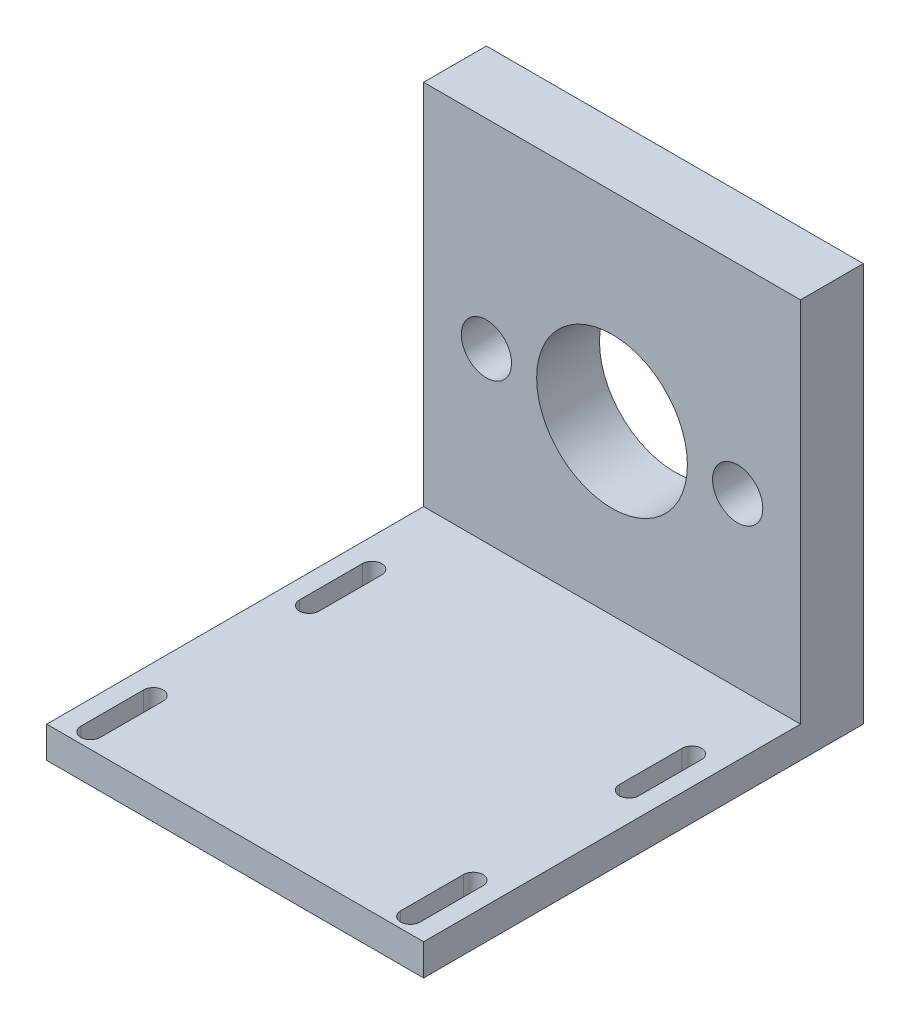
ISO-10303-21;
HEADER;
FILE_DESCRIPTION(('STEP AP214'),'2;1');
FILE_NAME('part.step','',(''),(''),'','','');
FILE_SCHEMA(('AUTOMOTIVE_DESIGN { 1 0 10303 214 1 1 1 1 }'));
ENDSEC;
DATA;
#1=APPLICATION_CONTEXT('core data for automotive mechanical design processes');
#2=APPLICATION_PROTOCOL_DEFINITION('international standard','automotive_design',2000,#1);
#3=PRODUCT_CONTEXT('',#1,'mechanical');
#4=PRODUCT('Part','Part','',(#3));
#5=PRODUCT_RELATED_PRODUCT_CATEGORY('part','',(#4));
#6=PRODUCT_DEFINITION_FORMATION('','',#4);
#7=PRODUCT_DEFINITION_CONTEXT('part definition',#1,'design');
#8=PRODUCT_DEFINITION('design','',#6,#7);
#9=PRODUCT_DEFINITION_SHAPE('','',#8);
#10=(LENGTH_UNIT() NAMED_UNIT(*) SI_UNIT(.MILLI.,.METRE.));
#11=(NAMED_UNIT(*) PLANE_ANGLE_UNIT() SI_UNIT($,.RADIAN.));
#12=(NAMED_UNIT(*) SI_UNIT($,.STERADIAN.) SOLID_ANGLE_UNIT());
#13=UNCERTAINTY_MEASURE_WITH_UNIT(LENGTH_MEASURE(1.E-05),#10,'distance_accuracy_value','');
#14=(GEOMETRIC_REPRESENTATION_CONTEXT(3) GLOBAL_UNCERTAINTY_ASSIGNED_CONTEXT((#13)) GLOBAL_UNIT_ASSIGNED_CONTEXT((#10,
#11,#12)) REPRESENTATION_CONTEXT('',''));
#15=CARTESIAN_POINT('',(0.,0.,0.));
#16=DIRECTION('',(0.,0.,1.));
#17=DIRECTION('',(1.,0.,0.));
#18=AXIS2_PLACEMENT_3D('',#15,#16,#17);
#19=CARTESIAN_POINT('',(-30.,-26.75,70.));
#20=DIRECTION('',(0.,-1.,0.));
#21=DIRECTION('',(1.,0.,0.));
#22=AXIS2_PLACEMENT_3D('',#19,#20,#21);
#23=PLANE('',#22);
#24=DIRECTION('',(0.,0.,-1.));
#25=VECTOR('',#24,1.);
#26=CARTESIAN_POINT('',(-23.9092592592593,-26.75,70.));
#27=LINE('',#26,#25);
#28=CARTESIAN_POINT('',(-23.9092592592593,-26.75,67.5574712643677));
#29=VERTEX_POINT('',#28);
#30=CARTESIAN_POINT('',(-23.9092592592593,-26.75,57.5574712643677));
#31=VERTEX_POINT('',#30);
#32=EDGE_CURVE('E550',#29,#31,#27,.T.);
#33=ORIENTED_EDGE('',*,*,#32,.F.);
#34=CARTESIAN_POINT('',(-25.4592592592593,-26.75,67.5574712643677));
#35=DIRECTION('',(0.,-1.,0.));
#36=DIRECTION('',(1.,0.,0.));
#37=AXIS2_PLACEMENT_3D('',#34,#35,#36);
#38=CIRCLE('',#37,1.54999999999999);
#39=CARTESIAN_POINT('',(-27.0092592592593,-26.75,67.5574712643677));
#40=VERTEX_POINT('',#39);
#41=EDGE_CURVE('E544',#29,#40,#38,.T.);
#42=ORIENTED_EDGE('',*,*,#41,.T.);
#43=DIRECTION('',(0.,0.,-1.));
#44=VECTOR('',#43,1.);
#45=CARTESIAN_POINT('',(-27.0092592592593,-26.75,70.));
#46=LINE('',#45,#44);
#47=CARTESIAN_POINT('',(-27.0092592592593,-26.75,57.5574712643677));
#48=VERTEX_POINT('',#47);
#49=EDGE_CURVE('E541',#40,#48,#46,.T.);
#50=ORIENTED_EDGE('',*,*,#49,.T.);
#51=CARTESIAN_POINT('',(-25.4592592592593,-26.75,57.5574712643677));
#52=DIRECTION('',(0.,-1.,0.));
#53=DIRECTION('',(1.,0.,0.));
#54=AXIS2_PLACEMENT_3D('',#51,#52,#53);
#55=CIRCLE('',#54,1.54999999999999);
#56=EDGE_CURVE('E547',#48,#31,#55,.T.);
#57=ORIENTED_EDGE('',*,*,#56,.T.);
#58=EDGE_LOOP('',(#33,#42,#50,#57));
#59=FACE_BOUND('',#58,.T.);
#60=DIRECTION('',(0.,0.,-1.));
#61=VECTOR('',#60,1.);
#62=CARTESIAN_POINT('',(27.0092592592593,-26.75,70.));
#63=LINE('',#62,#61);
#64=CARTESIAN_POINT('',(27.0092592592593,-26.75,32.7490421455937));
#65=VERTEX_POINT('',#64);
#66=CARTESIAN_POINT('',(27.0092592592593,-26.75,22.7490421455937));
#67=VERTEX_POINT('',#66);
#68=EDGE_CURVE('E13',#65,#67,#63,.T.);
#69=ORIENTED_EDGE('',*,*,#68,.F.);
#70=CARTESIAN_POINT('',(25.4592592592593,-26.75,32.7490421455937));
#71=DIRECTION('',(0.,-1.,0.));
#72=DIRECTION('',(1.,0.,0.));
#73=AXIS2_PLACEMENT_3D('',#70,#71,#72);
#74=CIRCLE('',#73,1.54999999999999);
#75=CARTESIAN_POINT('',(23.9092592592593,-26.75,32.7490421455937));
#76=VERTEX_POINT('',#75);
#77=EDGE_CURVE('E343',#65,#76,#74,.T.);
#78=ORIENTED_EDGE('',*,*,#77,.T.);
#79=DIRECTION('',(0.,0.,-1.));
#80=VECTOR('',#79,1.);
#81=CARTESIAN_POINT('',(23.9092592592593,-26.75,70.));
#82=LINE('',#81,#80);
#83=CARTESIAN_POINT('',(23.9092592592593,-26.75,22.7490421455937));
#84=VERTEX_POINT('',#83);
#85=EDGE_CURVE('E674',#76,#84,#82,.T.);
#86=ORIENTED_EDGE('',*,*,#85,.T.);
#87=CARTESIAN_POINT('',(25.4592592592593,-26.75,22.7490421455937));
#88=DIRECTION('',(0.,-1.,0.));
#89=DIRECTION('',(1.,0.,0.));
#90=AXIS2_PLACEMENT_3D('',#87,#88,#89);
#91=CIRCLE('',#90,1.54999999999999);
#92=EDGE_CURVE('E677',#84,#67,#91,.T.);
#93=ORIENTED_EDGE('',*,*,#92,.T.);
#94=EDGE_LOOP('',(#69,#78,#86,#93));
#95=FACE_BOUND('',#94,.T.);
#96=DIRECTION('',(-1.,0.,0.));
#97=VECTOR('',#96,1.);
#98=CARTESIAN_POINT('',(-30.,-26.75,10.));
#99=LINE('',#98,#97);
#100=CARTESIAN_POINT('',(30.,-26.75,10.));
#101=VERTEX_POINT('',#100);
#102=CARTESIAN_POINT('',(-30.,-26.75,10.));
#103=VERTEX_POINT('',#102);
#104=EDGE_CURVE('E604',#101,#103,#99,.T.);
#105=ORIENTED_EDGE('',*,*,#104,.T.);
#106=DIRECTION('',(0.,0.,-1.));
#107=VECTOR('',#106,1.);
#108=CARTESIAN_POINT('',(-30.,-26.75,70.));
#109=LINE('',#108,#107);
#110=CARTESIAN_POINT('',(-30.,-26.75,70.));
#111=VERTEX_POINT('',#110);
#112=EDGE_CURVE('E615',#111,#103,#109,.T.);
#113=ORIENTED_EDGE('',*,*,#112,.F.);
#114=DIRECTION('',(-1.,0.,0.));
#115=VECTOR('',#114,1.);
#116=CARTESIAN_POINT('',(-30.,-26.75,70.));
#117=LINE('',#116,#115);
#118=CARTESIAN_POINT('',(30.,-26.75,70.));
#119=VERTEX_POINT('',#118);
#120=EDGE_CURVE('E613',#119,#111,#117,.T.);
#121=ORIENTED_EDGE('',*,*,#120,.F.);
#122=DIRECTION('',(0.,0.,-1.));
#123=VECTOR('',#122,1.);
#124=CARTESIAN_POINT('',(30.,-26.75,70.));
#125=LINE('',#124,#123);
#126=EDGE_CURVE('E620',#119,#101,#125,.T.);
#127=ORIENTED_EDGE('',*,*,#126,.T.);
#128=EDGE_LOOP('',(#105,#113,#121,#127));
#129=FACE_BOUND('',#128,.T.);
#130=DIRECTION('',(0.,0.,-1.));
#131=VECTOR('',#130,1.);
#132=CARTESIAN_POINT('',(27.0092592592592,-26.75,70.));
#133=LINE('',#132,#131);
#134=CARTESIAN_POINT('',(27.0092592592593,-26.75,67.5574712643677));
#135=VERTEX_POINT('',#134);
#136=CARTESIAN_POINT('',(27.0092592592592,-26.75,57.5574712643677));
#137=VERTEX_POINT('',#136);
#138=EDGE_CURVE('E573',#135,#137,#133,.T.);
#139=ORIENTED_EDGE('',*,*,#138,.F.);
#140=CARTESIAN_POINT('',(25.4592592592593,-26.75,67.5574712643677));
#141=DIRECTION('',(0.,-1.,0.));
#142=DIRECTION('',(1.,0.,0.));
#143=AXIS2_PLACEMENT_3D('',#140,#141,#142);
#144=CIRCLE('',#143,1.54999999999999);
#145=CARTESIAN_POINT('',(23.9092592592593,-26.75,67.5574712643677));
#146=VERTEX_POINT('',#145);
#147=EDGE_CURVE('E578',#135,#146,#144,.T.);
#148=ORIENTED_EDGE('',*,*,#147,.T.);
#149=DIRECTION('',(0.,0.,-1.));
#150=VECTOR('',#149,1.);
#151=CARTESIAN_POINT('',(23.9092592592593,-26.75,70.));
#152=LINE('',#151,#150);
#153=CARTESIAN_POINT('',(23.9092592592593,-26.75,57.5574712643677));
#154=VERTEX_POINT('',#153);
#155=EDGE_CURVE('E575',#146,#154,#152,.T.);
#156=ORIENTED_EDGE('',*,*,#155,.T.);
#157=CARTESIAN_POINT('',(25.4592592592593,-26.75,57.5574712643677));
#158=DIRECTION('',(0.,-1.,0.));
#159=DIRECTION('',(1.,0.,0.));
#160=AXIS2_PLACEMENT_3D('',#157,#158,#159);
#161=CIRCLE('',#160,1.54999999999999);
#162=EDGE_CURVE('E581',#154,#137,#161,.T.);
#163=ORIENTED_EDGE('',*,*,#162,.T.);
#164=EDGE_LOOP('',(#139,#148,#156,#163));
#165=FACE_BOUND('',#164,.T.);
#166=DIRECTION('',(0.,0.,-1.));
#167=VECTOR('',#166,1.);
#168=CARTESIAN_POINT('',(-23.9092592592592,-26.75,70.));
#169=LINE('',#168,#167);
#170=CARTESIAN_POINT('',(-23.9092592592593,-26.75,32.7490421455937));
#171=VERTEX_POINT('',#170);
#172=CARTESIAN_POINT('',(-23.9092592592593,-26.75,22.7490421455937));
#173=VERTEX_POINT('',#172);
#174=EDGE_CURVE('E498',#171,#173,#169,.T.);
#175=ORIENTED_EDGE('',*,*,#174,.F.);
#176=CARTESIAN_POINT('',(-25.4592592592593,-26.75,32.7490421455937));
#177=DIRECTION('',(0.,-1.,0.));
#178=DIRECTION('',(1.,0.,0.));
#179=AXIS2_PLACEMENT_3D('',#176,#177,#178);
#180=CIRCLE('',#179,1.54999999999999);
#181=CARTESIAN_POINT('',(-27.0092592592593,-26.75,32.7490421455937));
#182=VERTEX_POINT('',#181);
#183=EDGE_CURVE('E512',#171,#182,#180,.T.);
#184=ORIENTED_EDGE('',*,*,#183,.T.);
#185=DIRECTION('',(0.,0.,-1.));
#186=VECTOR('',#185,1.);
#187=CARTESIAN_POINT('',(-27.0092592592592,-26.75,70.));
#188=LINE('',#187,#186);
#189=CARTESIAN_POINT('',(-27.0092592592593,-26.75,22.7490421455937));
#190=VERTEX_POINT('',#189);
#191=EDGE_CURVE('E516',#182,#190,#188,.T.);
#192=ORIENTED_EDGE('',*,*,#191,.T.);
#193=CARTESIAN_POINT('',(-25.4592592592593,-26.75,22.7490421455937));
#194=DIRECTION('',(0.,-1.,0.));
#195=DIRECTION('',(1.,0.,0.));
#196=AXIS2_PLACEMENT_3D('',#193,#194,#195);
#197=CIRCLE('',#196,1.54999999999999);
#198=EDGE_CURVE('E519',#190,#173,#197,.T.);
#199=ORIENTED_EDGE('',*,*,#198,.T.);
#200=EDGE_LOOP('',(#175,#184,#192,#199));
#201=FACE_BOUND('',#200,.T.);
#202=ADVANCED_FACE('F334',(#59,#95,#129,#165,#201),#23,.F.);
#203=CARTESIAN_POINT('',(-30.,-31.75,10.));
#204=DIRECTION('',(0.,1.,0.));
#205=DIRECTION('',(-1.,0.,0.));
#206=AXIS2_PLACEMENT_3D('',#203,#204,#205);
#207=PLANE('',#206);
#208=DIRECTION('',(0.,0.,-1.));
#209=VECTOR('',#208,1.);
#210=CARTESIAN_POINT('',(-23.9092592592593,-31.75,32.7490421455937));
#211=LINE('',#210,#209);
#212=CARTESIAN_POINT('',(-23.9092592592593,-31.75,32.7490421455937));
#213=VERTEX_POINT('',#212);
#214=CARTESIAN_POINT('',(-23.9092592592593,-31.75,22.7490421455937));
#215=VERTEX_POINT('',#214);
#216=EDGE_CURVE('E495',#213,#215,#211,.T.);
#217=ORIENTED_EDGE('',*,*,#216,.T.);
#218=CARTESIAN_POINT('',(-25.4592592592593,-31.75,22.7490421455937));
#219=DIRECTION('',(0.,-1.,0.));
#220=DIRECTION('',(0.,0.,-1.));
#221=AXIS2_PLACEMENT_3D('',#218,#219,#220);
#222=CIRCLE('',#221,1.54999999999999);
#223=CARTESIAN_POINT('',(-27.0092592592593,-31.75,22.7490421455937));
#224=VERTEX_POINT('',#223);
#225=EDGE_CURVE('E484',#224,#215,#222,.T.);
#226=ORIENTED_EDGE('',*,*,#225,.F.);
#227=DIRECTION('',(0.,0.,-1.));
#228=VECTOR('',#227,1.);
#229=CARTESIAN_POINT('',(-27.0092592592593,-31.75,32.7490421455937));
#230=LINE('',#229,#228);
#231=CARTESIAN_POINT('',(-27.0092592592592,-31.75,32.7490421455937));
#232=VERTEX_POINT('',#231);
#233=EDGE_CURVE('E504',#232,#224,#230,.T.);
#234=ORIENTED_EDGE('',*,*,#233,.F.);
#235=CARTESIAN_POINT('',(-25.4592592592593,-31.75,32.7490421455937));
#236=DIRECTION('',(0.,-1.,0.));
#237=DIRECTION('',(0.,0.,-1.));
#238=AXIS2_PLACEMENT_3D('',#235,#236,#237);
#239=CIRCLE('',#238,1.54999999999999);
#240=EDGE_CURVE('E503',#213,#232,#239,.T.);
#241=ORIENTED_EDGE('',*,*,#240,.F.);
#242=EDGE_LOOP('',(#217,#226,#234,#241));
#243=FACE_BOUND('',#242,.T.);
#244=DIRECTION('',(1.,0.,0.));
#245=VECTOR('',#244,1.);
#246=CARTESIAN_POINT('',(-30.,-31.75,0.));
#247=LINE('',#246,#245);
#248=CARTESIAN_POINT('',(-30.,-31.75,0.));
#249=VERTEX_POINT('',#248);
#250=CARTESIAN_POINT('',(30.,-31.75,0.));
#251=VERTEX_POINT('',#250);
#252=EDGE_CURVE('E639',#249,#251,#247,.T.);
#253=ORIENTED_EDGE('',*,*,#252,.T.);
#254=DIRECTION('',(0.,0.,-1.));
#255=VECTOR('',#254,1.);
#256=CARTESIAN_POINT('',(30.,-31.75,10.));
#257=LINE('',#256,#255);
#258=CARTESIAN_POINT('',(30.,-31.75,70.));
#259=VERTEX_POINT('',#258);
#260=EDGE_CURVE('E643',#259,#251,#257,.T.);
#261=ORIENTED_EDGE('',*,*,#260,.F.);
#262=DIRECTION('',(1.,0.,0.));
#263=VECTOR('',#262,1.);
#264=CARTESIAN_POINT('',(-30.,-31.75,70.));
#265=LINE('',#264,#263);
#266=CARTESIAN_POINT('',(-30.,-31.75,70.));
#267=VERTEX_POINT('',#266);
#268=EDGE_CURVE('E608',#267,#259,#265,.T.);
#269=ORIENTED_EDGE('',*,*,#268,.F.);
#270=DIRECTION('',(0.,0.,-1.));
#271=VECTOR('',#270,1.);
#272=CARTESIAN_POINT('',(-30.,-31.75,10.));
#273=LINE('',#272,#271);
#274=EDGE_CURVE('E653',#267,#249,#273,.T.);
#275=ORIENTED_EDGE('',*,*,#274,.T.);
#276=EDGE_LOOP('',(#253,#261,#269,#275));
#277=FACE_BOUND('',#276,.T.);
#278=CARTESIAN_POINT('',(25.4592592592593,-31.75,32.7490421455937));
#279=DIRECTION('',(0.,-1.,0.));
#280=DIRECTION('',(0.,0.,-1.));
#281=AXIS2_PLACEMENT_3D('',#278,#279,#280);
#282=CIRCLE('',#281,1.54999999999999);
#283=CARTESIAN_POINT('',(27.0092592592593,-31.75,32.7490421455937));
#284=VERTEX_POINT('',#283);
#285=CARTESIAN_POINT('',(23.9092592592593,-31.75,32.7490421455937));
#286=VERTEX_POINT('',#285);
#287=EDGE_CURVE('E592',#284,#286,#282,.T.);
#288=ORIENTED_EDGE('',*,*,#287,.F.);
#289=DIRECTION('',(0.,0.,-1.));
#290=VECTOR('',#289,1.);
#291=CARTESIAN_POINT('',(27.0092592592593,-31.75,32.7490421455937));
#292=LINE('',#291,#290);
#293=CARTESIAN_POINT('',(27.0092592592592,-31.75,22.7490421455937));
#294=VERTEX_POINT('',#293);
#295=EDGE_CURVE('E586',#284,#294,#292,.T.);
#296=ORIENTED_EDGE('',*,*,#295,.T.);
#297=CARTESIAN_POINT('',(25.4592592592593,-31.75,22.7490421455937));
#298=DIRECTION('',(0.,-1.,0.));
#299=DIRECTION('',(0.,0.,-1.));
#300=AXIS2_PLACEMENT_3D('',#297,#298,#299);
#301=CIRCLE('',#300,1.54999999999999);
#302=CARTESIAN_POINT('',(23.9092592592593,-31.75,22.7490421455937));
#303=VERTEX_POINT('',#302);
#304=EDGE_CURVE('E600',#303,#294,#301,.T.);
#305=ORIENTED_EDGE('',*,*,#304,.F.);
#306=DIRECTION('',(0.,0.,-1.));
#307=VECTOR('',#306,1.);
#308=CARTESIAN_POINT('',(23.9092592592593,-31.75,32.7490421455937));
#309=LINE('',#308,#307);
#310=EDGE_CURVE('E584',#286,#303,#309,.T.);
#311=ORIENTED_EDGE('',*,*,#310,.F.);
#312=EDGE_LOOP('',(#288,#296,#305,#311));
#313=FACE_BOUND('',#312,.T.);
#314=CARTESIAN_POINT('',(25.4592592592593,-31.75,57.5574712643677));
#315=DIRECTION('',(0.,-1.,0.));
#316=DIRECTION('',(0.,0.,-1.));
#317=AXIS2_PLACEMENT_3D('',#314,#315,#316);
#318=CIRCLE('',#317,1.54999999999999);
#319=CARTESIAN_POINT('',(23.9092592592592,-31.75,57.5574712643677));
#320=VERTEX_POINT('',#319);
#321=CARTESIAN_POINT('',(27.0092592592592,-31.75,57.5574712643677));
#322=VERTEX_POINT('',#321);
#323=EDGE_CURVE('E568',#320,#322,#318,.T.);
#324=ORIENTED_EDGE('',*,*,#323,.F.);
#325=DIRECTION('',(0.,0.,-1.));
#326=VECTOR('',#325,1.);
#327=CARTESIAN_POINT('',(23.9092592592592,-31.75,67.5574712643677));
#328=LINE('',#327,#326);
#329=CARTESIAN_POINT('',(23.9092592592593,-31.75,67.5574712643677));
#330=VERTEX_POINT('',#329);
#331=EDGE_CURVE('E552',#330,#320,#328,.T.);
#332=ORIENTED_EDGE('',*,*,#331,.F.);
#333=CARTESIAN_POINT('',(25.4592592592593,-31.75,67.5574712643677));
#334=DIRECTION('',(0.,-1.,0.));
#335=DIRECTION('',(0.,0.,-1.));
#336=AXIS2_PLACEMENT_3D('',#333,#334,#335);
#337=CIRCLE('',#336,1.54999999999999);
#338=CARTESIAN_POINT('',(27.0092592592592,-31.75,67.5574712643677));
#339=VERTEX_POINT('',#338);
#340=EDGE_CURVE('E560',#339,#330,#337,.T.);
#341=ORIENTED_EDGE('',*,*,#340,.F.);
#342=DIRECTION('',(0.,0.,-1.));
#343=VECTOR('',#342,1.);
#344=CARTESIAN_POINT('',(27.0092592592592,-31.75,67.5574712643677));
#345=LINE('',#344,#343);
#346=EDGE_CURVE('E554',#339,#322,#345,.T.);
#347=ORIENTED_EDGE('',*,*,#346,.T.);
#348=EDGE_LOOP('',(#324,#332,#341,#347));
#349=FACE_BOUND('',#348,.T.);
#350=DIRECTION('',(0.,0.,-1.));
#351=VECTOR('',#350,1.);
#352=CARTESIAN_POINT('',(-23.9092592592593,-31.75,67.5574712643677));
#353=LINE('',#352,#351);
#354=CARTESIAN_POINT('',(-23.9092592592593,-31.75,67.5574712643677));
#355=VERTEX_POINT('',#354);
#356=CARTESIAN_POINT('',(-23.9092592592593,-31.75,57.5574712643677));
#357=VERTEX_POINT('',#356);
#358=EDGE_CURVE('E523',#355,#357,#353,.T.);
#359=ORIENTED_EDGE('',*,*,#358,.T.);
#360=CARTESIAN_POINT('',(-25.4592592592593,-31.75,57.5574712643677));
#361=DIRECTION('',(0.,-1.,0.));
#362=DIRECTION('',(0.,0.,-1.));
#363=AXIS2_PLACEMENT_3D('',#360,#361,#362);
#364=CIRCLE('',#363,1.54999999999999);
#365=CARTESIAN_POINT('',(-27.0092592592593,-31.75,57.5574712643677));
#366=VERTEX_POINT('',#365);
#367=EDGE_CURVE('E537',#366,#357,#364,.T.);
#368=ORIENTED_EDGE('',*,*,#367,.F.);
#369=DIRECTION('',(0.,0.,-1.));
#370=VECTOR('',#369,1.);
#371=CARTESIAN_POINT('',(-27.0092592592593,-31.75,67.5574712643677));
#372=LINE('',#371,#370);
#373=CARTESIAN_POINT('',(-27.0092592592593,-31.75,67.5574712643677));
#374=VERTEX_POINT('',#373);
#375=EDGE_CURVE('E521',#374,#366,#372,.T.);
#376=ORIENTED_EDGE('',*,*,#375,.F.);
#377=CARTESIAN_POINT('',(-25.4592592592593,-31.75,67.5574712643677));
#378=DIRECTION('',(0.,-1.,0.));
#379=DIRECTION('',(0.,0.,-1.));
#380=AXIS2_PLACEMENT_3D('',#377,#378,#379);
#381=CIRCLE('',#380,1.54999999999999);
#382=EDGE_CURVE('E529',#355,#374,#381,.T.);
#383=ORIENTED_EDGE('',*,*,#382,.F.);
#384=EDGE_LOOP('',(#359,#368,#376,#383));
#385=FACE_BOUND('',#384,.T.);
#386=ADVANCED_FACE('F501',(#243,#277,#313,#349,#385),#207,.F.);
#387=CARTESIAN_POINT('',(0.,0.,10.));
#388=DIRECTION('',(0.,0.,-1.));
#389=DIRECTION('',(-1.,0.,0.));
#390=AXIS2_PLACEMENT_3D('',#387,#388,#389);
#391=PLANE('',#390);
#392=CARTESIAN_POINT('',(-20.,0.,10.));
#393=DIRECTION('',(0.,0.,1.));
#394=DIRECTION('',(-1.,0.,0.));
#395=AXIS2_PLACEMENT_3D('',#392,#393,#394);
#396=CIRCLE('',#395,4.);
#397=CARTESIAN_POINT('',(-24.,0.,10.));
#398=VERTEX_POINT('',#397);
#399=EDGE_CURVE('E623',#398,#398,#396,.T.);
#400=ORIENTED_EDGE('',*,*,#399,.F.);
#401=EDGE_LOOP('',(#400));
#402=FACE_BOUND('',#401,.T.);
#403=CARTESIAN_POINT('',(20.,0.,10.));
#404=DIRECTION('',(0.,0.,1.));
#405=DIRECTION('',(1.,0.,0.));
#406=AXIS2_PLACEMENT_3D('',#403,#404,#405);
#407=CIRCLE('',#406,4.);
#408=CARTESIAN_POINT('',(24.,0.,10.));
#409=VERTEX_POINT('',#408);
#410=EDGE_CURVE('E626',#409,#409,#407,.T.);
#411=ORIENTED_EDGE('',*,*,#410,.F.);
#412=EDGE_LOOP('',(#411));
#413=FACE_BOUND('',#412,.T.);
#414=CARTESIAN_POINT('',(0.,0.,10.));
#415=DIRECTION('',(0.,0.,1.));
#416=DIRECTION('',(1.,0.,0.));
#417=AXIS2_PLACEMENT_3D('',#414,#415,#416);
#418=CIRCLE('',#417,12.);
#419=CARTESIAN_POINT('',(12.,0.,10.));
#420=VERTEX_POINT('',#419);
#421=EDGE_CURVE('E630',#420,#420,#418,.T.);
#422=ORIENTED_EDGE('',*,*,#421,.F.);
#423=EDGE_LOOP('',(#422));
#424=FACE_BOUND('',#423,.T.);
#425=ORIENTED_EDGE('',*,*,#104,.F.);
#426=DIRECTION('',(0.,1.,0.));
#427=VECTOR('',#426,1.);
#428=CARTESIAN_POINT('',(30.,-31.75,10.));
#429=LINE('',#428,#427);
#430=CARTESIAN_POINT('',(30.,31.75,10.));
#431=VERTEX_POINT('',#430);
#432=EDGE_CURVE('E636',#101,#431,#429,.T.);
#433=ORIENTED_EDGE('',*,*,#432,.T.);
#434=DIRECTION('',(-1.,0.,0.));
#435=VECTOR('',#434,1.);
#436=CARTESIAN_POINT('',(-30.,31.75,10.));
#437=LINE('',#436,#435);
#438=CARTESIAN_POINT('',(-30.,31.75,10.));
#439=VERTEX_POINT('',#438);
#440=EDGE_CURVE('E638',#431,#439,#437,.T.);
#441=ORIENTED_EDGE('',*,*,#440,.T.);
#442=DIRECTION('',(0.,-1.,0.));
#443=VECTOR('',#442,1.);
#444=CARTESIAN_POINT('',(-30.,-31.75,10.));
#445=LINE('',#444,#443);
#446=EDGE_CURVE('E641',#439,#103,#445,.T.);
#447=ORIENTED_EDGE('',*,*,#446,.T.);
#448=EDGE_LOOP('',(#425,#433,#441,#447));
#449=FACE_BOUND('',#448,.T.);
#450=ADVANCED_FACE('F717',(#402,#413,#424,#449),#391,.F.);
#451=CARTESIAN_POINT('',(0.,0.,0.));
#452=DIRECTION('',(0.,0.,-1.));
#453=DIRECTION('',(-1.,0.,0.));
#454=AXIS2_PLACEMENT_3D('',#451,#452,#453);
#455=PLANE('',#454);
#456=CARTESIAN_POINT('',(20.,0.,0.));
#457=DIRECTION('',(0.,0.,-1.));
#458=DIRECTION('',(-1.,0.,0.));
#459=AXIS2_PLACEMENT_3D('',#456,#457,#458);
#460=CIRCLE('',#459,4.25000000000002);
#461=CARTESIAN_POINT('',(15.75,0.,0.));
#462=VERTEX_POINT('',#461);
#463=EDGE_CURVE('E665',#462,#462,#460,.F.);
#464=ORIENTED_EDGE('',*,*,#463,.T.);
#465=EDGE_LOOP('',(#464));
#466=FACE_BOUND('',#465,.T.);
#467=CARTESIAN_POINT('',(-20.,0.,0.));
#468=DIRECTION('',(0.,0.,-1.));
#469=DIRECTION('',(-1.,0.,0.));
#470=AXIS2_PLACEMENT_3D('',#467,#468,#469);
#471=CIRCLE('',#470,4.24999999999998);
#472=CARTESIAN_POINT('',(-24.25,0.,0.));
#473=VERTEX_POINT('',#472);
#474=EDGE_CURVE('E662',#473,#473,#471,.F.);
#475=ORIENTED_EDGE('',*,*,#474,.T.);
#476=EDGE_LOOP('',(#475));
#477=FACE_BOUND('',#476,.T.);
#478=DIRECTION('',(0.,1.,0.));
#479=VECTOR('',#478,1.);
#480=CARTESIAN_POINT('',(30.,-31.75,0.));
#481=LINE('',#480,#479);
#482=CARTESIAN_POINT('',(30.,31.75,0.));
#483=VERTEX_POINT('',#482);
#484=EDGE_CURVE('E633',#251,#483,#481,.T.);
#485=ORIENTED_EDGE('',*,*,#484,.F.);
#486=ORIENTED_EDGE('',*,*,#252,.F.);
#487=DIRECTION('',(0.,-1.,0.));
#488=VECTOR('',#487,1.);
#489=CARTESIAN_POINT('',(-30.,-31.75,0.));
#490=LINE('',#489,#488);
#491=CARTESIAN_POINT('',(-30.,31.75,0.));
#492=VERTEX_POINT('',#491);
#493=EDGE_CURVE('E648',#492,#249,#490,.T.);
#494=ORIENTED_EDGE('',*,*,#493,.F.);
#495=DIRECTION('',(-1.,0.,0.));
#496=VECTOR('',#495,1.);
#497=CARTESIAN_POINT('',(-30.,31.75,0.));
#498=LINE('',#497,#496);
#499=EDGE_CURVE('E646',#483,#492,#498,.T.);
#500=ORIENTED_EDGE('',*,*,#499,.F.);
#501=EDGE_LOOP('',(#485,#486,#494,#500));
#502=FACE_BOUND('',#501,.T.);
#503=CARTESIAN_POINT('',(0.,0.,0.));
#504=DIRECTION('',(0.,0.,1.));
#505=DIRECTION('',(1.,0.,0.));
#506=AXIS2_PLACEMENT_3D('',#503,#504,#505);
#507=CIRCLE('',#506,12.);
#508=CARTESIAN_POINT('',(12.,0.,0.));
#509=VERTEX_POINT('',#508);
#510=EDGE_CURVE('E629',#509,#509,#507,.T.);
#511=ORIENTED_EDGE('',*,*,#510,.T.);
#512=EDGE_LOOP('',(#511));
#513=FACE_BOUND('',#512,.T.);
#514=ADVANCED_FACE('F737',(#466,#477,#502,#513),#455,.T.);
#515=CARTESIAN_POINT('',(30.,-31.75,10.));
#516=DIRECTION('',(-1.,0.,0.));
#517=DIRECTION('',(0.,-1.,0.));
#518=AXIS2_PLACEMENT_3D('',#515,#516,#517);
#519=PLANE('',#518);
#520=ORIENTED_EDGE('',*,*,#484,.T.);
#521=DIRECTION('',(0.,0.,-1.));
#522=VECTOR('',#521,1.);
#523=CARTESIAN_POINT('',(30.,31.75,10.));
#524=LINE('',#523,#522);
#525=EDGE_CURVE('E659',#431,#483,#524,.T.);
#526=ORIENTED_EDGE('',*,*,#525,.F.);
#527=ORIENTED_EDGE('',*,*,#432,.F.);
#528=ORIENTED_EDGE('',*,*,#126,.F.);
#529=DIRECTION('',(0.,1.,0.));
#530=VECTOR('',#529,1.);
#531=CARTESIAN_POINT('',(30.,-26.75,70.));
#532=LINE('',#531,#530);
#533=EDGE_CURVE('E611',#259,#119,#532,.T.);
#534=ORIENTED_EDGE('',*,*,#533,.F.);
#535=ORIENTED_EDGE('',*,*,#260,.T.);
#536=EDGE_LOOP('',(#520,#526,#527,#528,#534,#535));
#537=FACE_BOUND('',#536,.T.);
#538=ADVANCED_FACE('F740',(#537),#519,.F.);
#539=CARTESIAN_POINT('',(-30.,31.75,10.));
#540=DIRECTION('',(0.,-1.,0.));
#541=DIRECTION('',(1.,0.,0.));
#542=AXIS2_PLACEMENT_3D('',#539,#540,#541);
#543=PLANE('',#542);
#544=ORIENTED_EDGE('',*,*,#499,.T.);
#545=DIRECTION('',(0.,0.,-1.));
#546=VECTOR('',#545,1.);
#547=CARTESIAN_POINT('',(-30.,31.75,10.));
#548=LINE('',#547,#546);
#549=EDGE_CURVE('E656',#439,#492,#548,.T.);
#550=ORIENTED_EDGE('',*,*,#549,.F.);
#551=ORIENTED_EDGE('',*,*,#440,.F.);
#552=ORIENTED_EDGE('',*,*,#525,.T.);
#553=EDGE_LOOP('',(#544,#550,#551,#552));
#554=FACE_BOUND('',#553,.T.);
#555=ADVANCED_FACE('F745',(#554),#543,.F.);
#556=CARTESIAN_POINT('',(-30.,-31.75,10.));
#557=DIRECTION('',(1.,0.,0.));
#558=DIRECTION('',(0.,1.,0.));
#559=AXIS2_PLACEMENT_3D('',#556,#557,#558);
#560=PLANE('',#559);
#561=ORIENTED_EDGE('',*,*,#493,.T.);
#562=ORIENTED_EDGE('',*,*,#274,.F.);
#563=DIRECTION('',(0.,-1.,0.));
#564=VECTOR('',#563,1.);
#565=CARTESIAN_POINT('',(-30.,-26.75,70.));
#566=LINE('',#565,#564);
#567=EDGE_CURVE('E605',#111,#267,#566,.T.);
#568=ORIENTED_EDGE('',*,*,#567,.F.);
#569=ORIENTED_EDGE('',*,*,#112,.T.);
#570=ORIENTED_EDGE('',*,*,#446,.F.);
#571=ORIENTED_EDGE('',*,*,#549,.T.);
#572=EDGE_LOOP('',(#561,#562,#568,#569,#570,#571));
#573=FACE_BOUND('',#572,.T.);
#574=ADVANCED_FACE('F733',(#573),#560,.F.);
#575=CARTESIAN_POINT('',(0.,0.,10.));
#576=DIRECTION('',(0.,0.,-1.));
#577=DIRECTION('',(-1.,0.,0.));
#578=AXIS2_PLACEMENT_3D('',#575,#576,#577);
#579=CYLINDRICAL_SURFACE('',#578,12.);
#580=ORIENTED_EDGE('',*,*,#421,.T.);
#581=EDGE_LOOP('',(#580));
#582=FACE_BOUND('',#581,.T.);
#583=ORIENTED_EDGE('',*,*,#510,.F.);
#584=EDGE_LOOP('',(#583));
#585=FACE_BOUND('',#584,.T.);
#586=ADVANCED_FACE('F729',(#582,#585),#579,.F.);
#587=CARTESIAN_POINT('',(20.,0.,10.));
#588=DIRECTION('',(0.,0.,-1.));
#589=DIRECTION('',(-1.,0.,0.));
#590=AXIS2_PLACEMENT_3D('',#587,#588,#589);
#591=CYLINDRICAL_SURFACE('',#590,4.);
#592=CARTESIAN_POINT('',(20.,0.,0.250000000000019));
#593=DIRECTION('',(0.,0.,-1.));
#594=DIRECTION('',(-1.,0.,0.));
#595=AXIS2_PLACEMENT_3D('',#592,#593,#594);
#596=CIRCLE('',#595,4.);
#597=CARTESIAN_POINT('',(16.,0.,0.250000000000019));
#598=VERTEX_POINT('',#597);
#599=EDGE_CURVE('E668',#598,#598,#596,.T.);
#600=ORIENTED_EDGE('',*,*,#599,.T.);
#601=EDGE_LOOP('',(#600));
#602=FACE_BOUND('',#601,.T.);
#603=ORIENTED_EDGE('',*,*,#410,.T.);
#604=EDGE_LOOP('',(#603));
#605=FACE_BOUND('',#604,.T.);
#606=ADVANCED_FACE('F725',(#602,#605),#591,.F.);
#607=CARTESIAN_POINT('',(-20.,0.,10.));
#608=DIRECTION('',(0.,0.,-1.));
#609=DIRECTION('',(-1.,0.,0.));
#610=AXIS2_PLACEMENT_3D('',#607,#608,#609);
#611=CYLINDRICAL_SURFACE('',#610,4.);
#612=CARTESIAN_POINT('',(-20.,0.,0.249999999999985));
#613=DIRECTION('',(0.,0.,-1.));
#614=DIRECTION('',(-1.,0.,0.));
#615=AXIS2_PLACEMENT_3D('',#612,#613,#614);
#616=CIRCLE('',#615,4.);
#617=CARTESIAN_POINT('',(-24.,0.,0.249999999999985));
#618=VERTEX_POINT('',#617);
#619=EDGE_CURVE('E671',#618,#618,#616,.T.);
#620=ORIENTED_EDGE('',*,*,#619,.T.);
#621=EDGE_LOOP('',(#620));
#622=FACE_BOUND('',#621,.T.);
#623=ORIENTED_EDGE('',*,*,#399,.T.);
#624=EDGE_LOOP('',(#623));
#625=FACE_BOUND('',#624,.T.);
#626=ADVANCED_FACE('F721',(#622,#625),#611,.F.);
#627=CARTESIAN_POINT('',(20.,0.,0.));
#628=DIRECTION('',(0.,0.,-1.));
#629=DIRECTION('',(-1.,0.,0.));
#630=AXIS2_PLACEMENT_3D('',#627,#628,#629);
#631=CONICAL_SURFACE('',#630,4.25000000000002,0.785398163397447);
#632=ORIENTED_EDGE('',*,*,#599,.F.);
#633=EDGE_LOOP('',(#632));
#634=FACE_BOUND('',#633,.T.);
#635=ORIENTED_EDGE('',*,*,#463,.F.);
#636=EDGE_LOOP('',(#635));
#637=FACE_BOUND('',#636,.T.);
#638=ADVANCED_FACE('F724',(#634,#637),#631,.F.);
#639=CARTESIAN_POINT('',(-20.,0.,0.));
#640=DIRECTION('',(0.,0.,-1.));
#641=DIRECTION('',(-1.,0.,0.));
#642=AXIS2_PLACEMENT_3D('',#639,#640,#641);
#643=CONICAL_SURFACE('',#642,4.24999999999998,0.785398163397447);
#644=ORIENTED_EDGE('',*,*,#619,.F.);
#645=EDGE_LOOP('',(#644));
#646=FACE_BOUND('',#645,.T.);
#647=ORIENTED_EDGE('',*,*,#474,.F.);
#648=EDGE_LOOP('',(#647));
#649=FACE_BOUND('',#648,.T.);
#650=ADVANCED_FACE('F337',(#646,#649),#643,.F.);
#651=CARTESIAN_POINT('',(0.,0.,70.));
#652=DIRECTION('',(0.,0.,1.));
#653=DIRECTION('',(1.,0.,0.));
#654=AXIS2_PLACEMENT_3D('',#651,#652,#653);
#655=PLANE('',#654);
#656=ORIENTED_EDGE('',*,*,#567,.T.);
#657=ORIENTED_EDGE('',*,*,#268,.T.);
#658=ORIENTED_EDGE('',*,*,#533,.T.);
#659=ORIENTED_EDGE('',*,*,#120,.T.);
#660=EDGE_LOOP('',(#656,#657,#658,#659));
#661=FACE_BOUND('',#660,.T.);
#662=ADVANCED_FACE('F708',(#661),#655,.T.);
#663=CARTESIAN_POINT('',(25.4592592592593,-31.75,32.7490421455937));
#664=DIRECTION('',(0.,-1.,0.));
#665=DIRECTION('',(0.,0.,-1.));
#666=AXIS2_PLACEMENT_3D('',#663,#664,#665);
#667=CYLINDRICAL_SURFACE('',#666,1.54999999999999);
#668=DIRECTION('',(0.,1.,0.));
#669=VECTOR('',#668,1.);
#670=CARTESIAN_POINT('',(27.0092592592593,31.75,32.7490421455937));
#671=LINE('',#670,#669);
#672=EDGE_CURVE('E589',#284,#65,#671,.T.);
#673=ORIENTED_EDGE('',*,*,#672,.F.);
#674=ORIENTED_EDGE('',*,*,#287,.T.);
#675=DIRECTION('',(0.,-1.,0.));
#676=VECTOR('',#675,1.);
#677=CARTESIAN_POINT('',(23.9092592592593,-31.75,32.7490421455937));
#678=LINE('',#677,#676);
#679=EDGE_CURVE('E594',#76,#286,#678,.T.);
#680=ORIENTED_EDGE('',*,*,#679,.F.);
#681=ORIENTED_EDGE('',*,*,#77,.F.);
#682=EDGE_LOOP('',(#673,#674,#680,#681));
#683=FACE_BOUND('',#682,.T.);
#684=ADVANCED_FACE('F686',(#683),#667,.F.);
#685=CARTESIAN_POINT('',(25.4592592592593,-31.75,22.7490421455937));
#686=DIRECTION('',(0.,-1.,0.));
#687=DIRECTION('',(0.,0.,-1.));
#688=AXIS2_PLACEMENT_3D('',#685,#686,#687);
#689=CYLINDRICAL_SURFACE('',#688,1.54999999999999);
#690=DIRECTION('',(0.,-1.,0.));
#691=VECTOR('',#690,1.);
#692=CARTESIAN_POINT('',(23.9092592592593,-31.75,22.7490421455937));
#693=LINE('',#692,#691);
#694=EDGE_CURVE('E602',#303,#84,#693,.F.);
#695=ORIENTED_EDGE('',*,*,#694,.F.);
#696=ORIENTED_EDGE('',*,*,#304,.T.);
#697=DIRECTION('',(0.,1.,0.));
#698=VECTOR('',#697,1.);
#699=CARTESIAN_POINT('',(27.0092592592593,31.75,22.7490421455937));
#700=LINE('',#699,#698);
#701=EDGE_CURVE('E597',#294,#67,#700,.T.);
#702=ORIENTED_EDGE('',*,*,#701,.T.);
#703=ORIENTED_EDGE('',*,*,#92,.F.);
#704=EDGE_LOOP('',(#695,#696,#702,#703));
#705=FACE_BOUND('',#704,.T.);
#706=ADVANCED_FACE('F700',(#705),#689,.F.);
#707=CARTESIAN_POINT('',(27.0092592592593,31.75,32.7490421455937));
#708=DIRECTION('',(-1.,0.,0.));
#709=DIRECTION('',(0.,0.,1.));
#710=AXIS2_PLACEMENT_3D('',#707,#708,#709);
#711=PLANE('',#710);
#712=ORIENTED_EDGE('',*,*,#68,.T.);
#713=ORIENTED_EDGE('',*,*,#701,.F.);
#714=ORIENTED_EDGE('',*,*,#295,.F.);
#715=ORIENTED_EDGE('',*,*,#672,.T.);
#716=EDGE_LOOP('',(#712,#713,#714,#715));
#717=FACE_BOUND('',#716,.T.);
#718=ADVANCED_FACE('F689',(#717),#711,.T.);
#719=CARTESIAN_POINT('',(23.9092592592593,-31.75,32.7490421455937));
#720=DIRECTION('',(-1.,0.,0.));
#721=DIRECTION('',(0.,0.,1.));
#722=AXIS2_PLACEMENT_3D('',#719,#720,#721);
#723=PLANE('',#722);
#724=ORIENTED_EDGE('',*,*,#679,.T.);
#725=ORIENTED_EDGE('',*,*,#310,.T.);
#726=ORIENTED_EDGE('',*,*,#694,.T.);
#727=ORIENTED_EDGE('',*,*,#85,.F.);
#728=EDGE_LOOP('',(#724,#725,#726,#727));
#729=FACE_BOUND('',#728,.T.);
#730=ADVANCED_FACE('F696',(#729),#723,.F.);
#731=CARTESIAN_POINT('',(25.4592592592593,-31.75,57.5574712643677));
#732=DIRECTION('',(0.,-1.,0.));
#733=DIRECTION('',(0.,0.,-1.));
#734=AXIS2_PLACEMENT_3D('',#731,#732,#733);
#735=CYLINDRICAL_SURFACE('',#734,1.54999999999999);
#736=DIRECTION('',(0.,-1.,0.));
#737=VECTOR('',#736,1.);
#738=CARTESIAN_POINT('',(23.9092592592593,-31.75,57.5574712643677));
#739=LINE('',#738,#737);
#740=EDGE_CURVE('E571',#320,#154,#739,.F.);
#741=ORIENTED_EDGE('',*,*,#740,.F.);
#742=ORIENTED_EDGE('',*,*,#323,.T.);
#743=DIRECTION('',(0.,1.,0.));
#744=VECTOR('',#743,1.);
#745=CARTESIAN_POINT('',(27.0092592592592,31.75,57.5574712643677));
#746=LINE('',#745,#744);
#747=EDGE_CURVE('E565',#322,#137,#746,.T.);
#748=ORIENTED_EDGE('',*,*,#747,.T.);
#749=ORIENTED_EDGE('',*,*,#162,.F.);
#750=EDGE_LOOP('',(#741,#742,#748,#749));
#751=FACE_BOUND('',#750,.T.);
#752=ADVANCED_FACE('F829',(#751),#735,.F.);
#753=CARTESIAN_POINT('',(25.4592592592593,-31.75,67.5574712643677));
#754=DIRECTION('',(0.,-1.,0.));
#755=DIRECTION('',(0.,0.,-1.));
#756=AXIS2_PLACEMENT_3D('',#753,#754,#755);
#757=CYLINDRICAL_SURFACE('',#756,1.54999999999999);
#758=DIRECTION('',(0.,1.,0.));
#759=VECTOR('',#758,1.);
#760=CARTESIAN_POINT('',(27.0092592592593,31.75,67.5574712643677));
#761=LINE('',#760,#759);
#762=EDGE_CURVE('E557',#339,#135,#761,.T.);
#763=ORIENTED_EDGE('',*,*,#762,.F.);
#764=ORIENTED_EDGE('',*,*,#340,.T.);
#765=DIRECTION('',(0.,-1.,0.));
#766=VECTOR('',#765,1.);
#767=CARTESIAN_POINT('',(23.9092592592593,-31.75,67.5574712643677));
#768=LINE('',#767,#766);
#769=EDGE_CURVE('E563',#146,#330,#768,.T.);
#770=ORIENTED_EDGE('',*,*,#769,.F.);
#771=ORIENTED_EDGE('',*,*,#147,.F.);
#772=EDGE_LOOP('',(#763,#764,#770,#771));
#773=FACE_BOUND('',#772,.T.);
#774=ADVANCED_FACE('F822',(#773),#757,.F.);
#775=CARTESIAN_POINT('',(23.9092592592593,-31.75,67.5574712643677));
#776=DIRECTION('',(-1.,0.,0.));
#777=DIRECTION('',(0.,0.,1.));
#778=AXIS2_PLACEMENT_3D('',#775,#776,#777);
#779=PLANE('',#778);
#780=ORIENTED_EDGE('',*,*,#769,.T.);
#781=ORIENTED_EDGE('',*,*,#331,.T.);
#782=ORIENTED_EDGE('',*,*,#740,.T.);
#783=ORIENTED_EDGE('',*,*,#155,.F.);
#784=EDGE_LOOP('',(#780,#781,#782,#783));
#785=FACE_BOUND('',#784,.T.);
#786=ADVANCED_FACE('F819',(#785),#779,.F.);
#787=CARTESIAN_POINT('',(27.0092592592593,31.75,67.5574712643677));
#788=DIRECTION('',(-1.,0.,0.));
#789=DIRECTION('',(0.,0.,1.));
#790=AXIS2_PLACEMENT_3D('',#787,#788,#789);
#791=PLANE('',#790);
#792=ORIENTED_EDGE('',*,*,#138,.T.);
#793=ORIENTED_EDGE('',*,*,#747,.F.);
#794=ORIENTED_EDGE('',*,*,#346,.F.);
#795=ORIENTED_EDGE('',*,*,#762,.T.);
#796=EDGE_LOOP('',(#792,#793,#794,#795));
#797=FACE_BOUND('',#796,.T.);
#798=ADVANCED_FACE('F811',(#797),#791,.T.);
#799=CARTESIAN_POINT('',(-23.9092592592593,31.75,67.5574712643677));
#800=DIRECTION('',(-1.,0.,0.));
#801=DIRECTION('',(0.,0.,1.));
#802=AXIS2_PLACEMENT_3D('',#799,#800,#801);
#803=PLANE('',#802);
#804=ORIENTED_EDGE('',*,*,#32,.T.);
#805=DIRECTION('',(0.,1.,0.));
#806=VECTOR('',#805,1.);
#807=CARTESIAN_POINT('',(-23.9092592592593,31.75,57.5574712643677));
#808=LINE('',#807,#806);
#809=EDGE_CURVE('E534',#357,#31,#808,.T.);
#810=ORIENTED_EDGE('',*,*,#809,.F.);
#811=ORIENTED_EDGE('',*,*,#358,.F.);
#812=DIRECTION('',(0.,1.,0.));
#813=VECTOR('',#812,1.);
#814=CARTESIAN_POINT('',(-23.9092592592593,31.75,67.5574712643677));
#815=LINE('',#814,#813);
#816=EDGE_CURVE('E526',#355,#29,#815,.T.);
#817=ORIENTED_EDGE('',*,*,#816,.T.);
#818=EDGE_LOOP('',(#804,#810,#811,#817));
#819=FACE_BOUND('',#818,.T.);
#820=ADVANCED_FACE('F807',(#819),#803,.T.);
#821=CARTESIAN_POINT('',(-25.4592592592593,-31.75,57.5574712643677));
#822=DIRECTION('',(0.,-1.,0.));
#823=DIRECTION('',(0.,0.,-1.));
#824=AXIS2_PLACEMENT_3D('',#821,#822,#823);
#825=CYLINDRICAL_SURFACE('',#824,1.54999999999999);
#826=DIRECTION('',(0.,-1.,0.));
#827=VECTOR('',#826,1.);
#828=CARTESIAN_POINT('',(-27.0092592592593,-31.75,57.5574712643677));
#829=LINE('',#828,#827);
#830=EDGE_CURVE('E539',#366,#48,#829,.F.);
#831=ORIENTED_EDGE('',*,*,#830,.F.);
#832=ORIENTED_EDGE('',*,*,#367,.T.);
#833=ORIENTED_EDGE('',*,*,#809,.T.);
#834=ORIENTED_EDGE('',*,*,#56,.F.);
#835=EDGE_LOOP('',(#831,#832,#833,#834));
#836=FACE_BOUND('',#835,.T.);
#837=ADVANCED_FACE('F810',(#836),#825,.F.);
#838=CARTESIAN_POINT('',(-25.4592592592593,-31.75,67.5574712643677));
#839=DIRECTION('',(0.,-1.,0.));
#840=DIRECTION('',(0.,0.,-1.));
#841=AXIS2_PLACEMENT_3D('',#838,#839,#840);
#842=CYLINDRICAL_SURFACE('',#841,1.54999999999999);
#843=ORIENTED_EDGE('',*,*,#816,.F.);
#844=ORIENTED_EDGE('',*,*,#382,.T.);
#845=DIRECTION('',(0.,-1.,0.));
#846=VECTOR('',#845,1.);
#847=CARTESIAN_POINT('',(-27.0092592592593,-31.75,67.5574712643677));
#848=LINE('',#847,#846);
#849=EDGE_CURVE('E531',#40,#374,#848,.T.);
#850=ORIENTED_EDGE('',*,*,#849,.F.);
#851=ORIENTED_EDGE('',*,*,#41,.F.);
#852=EDGE_LOOP('',(#843,#844,#850,#851));
#853=FACE_BOUND('',#852,.T.);
#854=ADVANCED_FACE('F805',(#853),#842,.F.);
#855=CARTESIAN_POINT('',(-27.0092592592593,-31.75,67.5574712643677));
#856=DIRECTION('',(-1.,0.,0.));
#857=DIRECTION('',(0.,0.,1.));
#858=AXIS2_PLACEMENT_3D('',#855,#856,#857);
#859=PLANE('',#858);
#860=ORIENTED_EDGE('',*,*,#849,.T.);
#861=ORIENTED_EDGE('',*,*,#375,.T.);
#862=ORIENTED_EDGE('',*,*,#830,.T.);
#863=ORIENTED_EDGE('',*,*,#49,.F.);
#864=EDGE_LOOP('',(#860,#861,#862,#863));
#865=FACE_BOUND('',#864,.T.);
#866=ADVANCED_FACE('F802',(#865),#859,.F.);
#867=CARTESIAN_POINT('',(-25.4592592592593,-31.75,22.7490421455937));
#868=DIRECTION('',(0.,-1.,0.));
#869=DIRECTION('',(0.,0.,-1.));
#870=AXIS2_PLACEMENT_3D('',#867,#868,#869);
#871=CYLINDRICAL_SURFACE('',#870,1.54999999999999);
#872=DIRECTION('',(0.,-1.,0.));
#873=VECTOR('',#872,1.);
#874=CARTESIAN_POINT('',(-27.0092592592593,-31.75,22.7490421455937));
#875=LINE('',#874,#873);
#876=EDGE_CURVE('E350',#224,#190,#875,.F.);
#877=ORIENTED_EDGE('',*,*,#876,.F.);
#878=ORIENTED_EDGE('',*,*,#225,.T.);
#879=DIRECTION('',(0.,1.,0.));
#880=VECTOR('',#879,1.);
#881=CARTESIAN_POINT('',(-23.9092592592593,31.75,22.7490421455937));
#882=LINE('',#881,#880);
#883=EDGE_CURVE('E487',#215,#173,#882,.T.);
#884=ORIENTED_EDGE('',*,*,#883,.T.);
#885=ORIENTED_EDGE('',*,*,#198,.F.);
#886=EDGE_LOOP('',(#877,#878,#884,#885));
#887=FACE_BOUND('',#886,.T.);
#888=ADVANCED_FACE('F486',(#887),#871,.F.);
#889=CARTESIAN_POINT('',(-27.0092592592593,-31.75,32.7490421455937));
#890=DIRECTION('',(-1.,0.,0.));
#891=DIRECTION('',(0.,0.,1.));
#892=AXIS2_PLACEMENT_3D('',#889,#890,#891);
#893=PLANE('',#892);
#894=DIRECTION('',(0.,-1.,0.));
#895=VECTOR('',#894,1.);
#896=CARTESIAN_POINT('',(-27.0092592592593,-31.75,32.7490421455937));
#897=LINE('',#896,#895);
#898=EDGE_CURVE('E499',#182,#232,#897,.T.);
#899=ORIENTED_EDGE('',*,*,#898,.T.);
#900=ORIENTED_EDGE('',*,*,#233,.T.);
#901=ORIENTED_EDGE('',*,*,#876,.T.);
#902=ORIENTED_EDGE('',*,*,#191,.F.);
#903=EDGE_LOOP('',(#899,#900,#901,#902));
#904=FACE_BOUND('',#903,.T.);
#905=ADVANCED_FACE('F790',(#904),#893,.F.);
#906=CARTESIAN_POINT('',(-23.9092592592593,31.75,32.7490421455937));
#907=DIRECTION('',(-1.,0.,0.));
#908=DIRECTION('',(0.,0.,1.));
#909=AXIS2_PLACEMENT_3D('',#906,#907,#908);
#910=PLANE('',#909);
#911=ORIENTED_EDGE('',*,*,#174,.T.);
#912=ORIENTED_EDGE('',*,*,#883,.F.);
#913=ORIENTED_EDGE('',*,*,#216,.F.);
#914=DIRECTION('',(0.,1.,0.));
#915=VECTOR('',#914,1.);
#916=CARTESIAN_POINT('',(-23.9092592592593,31.75,32.7490421455937));
#917=LINE('',#916,#915);
#918=EDGE_CURVE('E358',#213,#171,#917,.T.);
#919=ORIENTED_EDGE('',*,*,#918,.T.);
#920=EDGE_LOOP('',(#911,#912,#913,#919));
#921=FACE_BOUND('',#920,.T.);
#922=ADVANCED_FACE('F494',(#921),#910,.T.);
#923=CARTESIAN_POINT('',(-25.4592592592593,-31.75,32.7490421455937));
#924=DIRECTION('',(0.,-1.,0.));
#925=DIRECTION('',(0.,0.,-1.));
#926=AXIS2_PLACEMENT_3D('',#923,#924,#925);
#927=CYLINDRICAL_SURFACE('',#926,1.54999999999999);
#928=ORIENTED_EDGE('',*,*,#918,.F.);
#929=ORIENTED_EDGE('',*,*,#240,.T.);
#930=ORIENTED_EDGE('',*,*,#898,.F.);
#931=ORIENTED_EDGE('',*,*,#183,.F.);
#932=EDGE_LOOP('',(#928,#929,#930,#931));
#933=FACE_BOUND('',#932,.T.);
#934=ADVANCED_FACE('F791',(#933),#927,.F.);
#935=CLOSED_SHELL('',(#202,#386,#450,#514,#538,#555,#574,#586,#606,#626,#638,#650,#662,#684,
#706,#718,#730,#752,#774,#786,#798,#820,#837,#854,#866,#888,#905,#922,#934));
#936=MANIFOLD_SOLID_BREP('B2',#935);
#937=ADVANCED_BREP_SHAPE_REPRESENTATION('',(#18,#936),#14);
#938=SHAPE_DEFINITION_REPRESENTATION(#9,#937);
ENDSEC;
END-ISO-10303-21;
